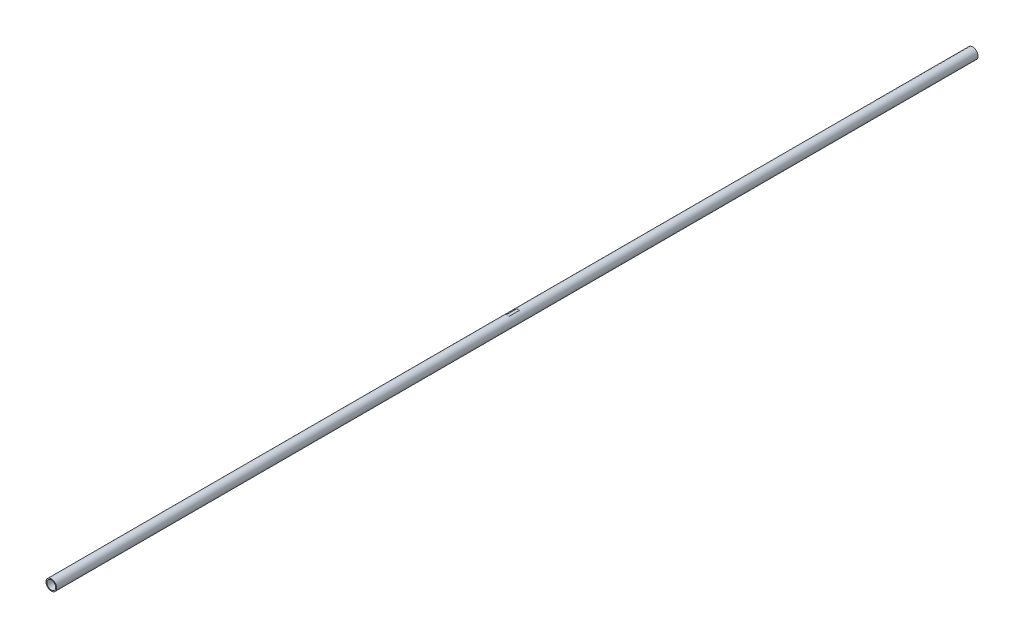
ISO-10303-21;
HEADER;
FILE_DESCRIPTION(('STEP AP214'),'2;1');
FILE_NAME('part.step','',(''),(''),'','','');
FILE_SCHEMA(('AUTOMOTIVE_DESIGN { 1 0 10303 214 1 1 1 1 }'));
ENDSEC;
DATA;
#1=APPLICATION_CONTEXT('core data for automotive mechanical design processes');
#2=APPLICATION_PROTOCOL_DEFINITION('international standard','automotive_design',2000,#1);
#3=PRODUCT_CONTEXT('',#1,'mechanical');
#4=PRODUCT('Part','Part','',(#3));
#5=PRODUCT_RELATED_PRODUCT_CATEGORY('part','',(#4));
#6=PRODUCT_DEFINITION_FORMATION('','',#4);
#7=PRODUCT_DEFINITION_CONTEXT('part definition',#1,'design');
#8=PRODUCT_DEFINITION('design','',#6,#7);
#9=PRODUCT_DEFINITION_SHAPE('','',#8);
#10=(LENGTH_UNIT() NAMED_UNIT(*) SI_UNIT(.MILLI.,.METRE.));
#11=(NAMED_UNIT(*) PLANE_ANGLE_UNIT() SI_UNIT($,.RADIAN.));
#12=(NAMED_UNIT(*) SI_UNIT($,.STERADIAN.) SOLID_ANGLE_UNIT());
#13=UNCERTAINTY_MEASURE_WITH_UNIT(LENGTH_MEASURE(1.E-05),#10,'distance_accuracy_value','');
#14=(GEOMETRIC_REPRESENTATION_CONTEXT(3) GLOBAL_UNCERTAINTY_ASSIGNED_CONTEXT((#13)) GLOBAL_UNIT_ASSIGNED_CONTEXT((#10,
#11,#12)) REPRESENTATION_CONTEXT('',''));
#15=CARTESIAN_POINT('',(0.,0.,0.));
#16=DIRECTION('',(0.,0.,1.));
#17=DIRECTION('',(1.,0.,0.));
#18=AXIS2_PLACEMENT_3D('',#15,#16,#17);
#19=CARTESIAN_POINT('',(0.,0.,3657.6));
#20=DIRECTION('',(0.,0.,1.));
#21=DIRECTION('',(1.,0.,0.));
#22=AXIS2_PLACEMENT_3D('',#19,#20,#21);
#23=PLANE('',#22);
#24=CARTESIAN_POINT('',(0.,0.,3657.6));
#25=DIRECTION('',(0.,0.,1.));
#26=DIRECTION('',(1.,0.,0.));
#27=AXIS2_PLACEMENT_3D('',#24,#25,#26);
#28=CIRCLE('',#27,21.082);
#29=CARTESIAN_POINT('',(21.082,0.,3657.6));
#30=VERTEX_POINT('',#29);
#31=EDGE_CURVE('E102',#30,#30,#28,.T.);
#32=ORIENTED_EDGE('',*,*,#31,.T.);
#33=EDGE_LOOP('',(#32));
#34=FACE_BOUND('',#33,.T.);
#35=CARTESIAN_POINT('',(0.,0.,3657.6));
#36=DIRECTION('',(0.,0.,1.));
#37=DIRECTION('',(1.,0.,0.));
#38=AXIS2_PLACEMENT_3D('',#35,#36,#37);
#39=CIRCLE('',#38,17.526);
#40=CARTESIAN_POINT('',(-17.526,0.,3657.6));
#41=VERTEX_POINT('',#40);
#42=EDGE_CURVE('E106',#41,#41,#39,.T.);
#43=ORIENTED_EDGE('',*,*,#42,.F.);
#44=EDGE_LOOP('',(#43));
#45=FACE_BOUND('',#44,.T.);
#46=ADVANCED_FACE('F51',(#34,#45),#23,.T.);
#47=CARTESIAN_POINT('',(0.,0.,0.));
#48=DIRECTION('',(0.,0.,1.));
#49=DIRECTION('',(1.,0.,0.));
#50=AXIS2_PLACEMENT_3D('',#47,#48,#49);
#51=PLANE('',#50);
#52=CARTESIAN_POINT('',(0.,0.,0.));
#53=DIRECTION('',(0.,0.,1.));
#54=DIRECTION('',(1.,0.,0.));
#55=AXIS2_PLACEMENT_3D('',#52,#53,#54);
#56=CIRCLE('',#55,21.082);
#57=CARTESIAN_POINT('',(21.082,0.,0.));
#58=VERTEX_POINT('',#57);
#59=EDGE_CURVE('E103',#58,#58,#56,.T.);
#60=ORIENTED_EDGE('',*,*,#59,.F.);
#61=EDGE_LOOP('',(#60));
#62=FACE_BOUND('',#61,.T.);
#63=CARTESIAN_POINT('',(0.,0.,0.));
#64=DIRECTION('',(0.,0.,1.));
#65=DIRECTION('',(1.,0.,0.));
#66=AXIS2_PLACEMENT_3D('',#63,#64,#65);
#67=CIRCLE('',#66,17.526);
#68=CARTESIAN_POINT('',(-17.526,0.,-4.44089209850063E-13));
#69=VERTEX_POINT('',#68);
#70=EDGE_CURVE('E92',#69,#69,#67,.T.);
#71=ORIENTED_EDGE('',*,*,#70,.T.);
#72=EDGE_LOOP('',(#71));
#73=FACE_BOUND('',#72,.T.);
#74=ADVANCED_FACE('F119',(#62,#73),#51,.F.);
#75=CARTESIAN_POINT('',(0.,0.,3657.6));
#76=DIRECTION('',(0.,0.,-1.));
#77=DIRECTION('',(-1.,0.,0.));
#78=AXIS2_PLACEMENT_3D('',#75,#76,#77);
#79=CYLINDRICAL_SURFACE('',#78,21.082);
#80=CARTESIAN_POINT('',(0.,0.,1846.16364197576));
#81=DIRECTION('',(0.,0.,1.));
#82=DIRECTION('',(1.,0.,0.));
#83=AXIS2_PLACEMENT_3D('',#80,#81,#82);
#84=CIRCLE('',#83,21.082);
#85=CARTESIAN_POINT('',(5.572983860416,20.3320578125172,1846.16364197576));
#86=VERTEX_POINT('',#85);
#87=CARTESIAN_POINT('',(-5.57298386041601,20.3320578125172,1846.16364197576));
#88=VERTEX_POINT('',#87);
#89=EDGE_CURVE('E60',#86,#88,#84,.T.);
#90=ORIENTED_EDGE('',*,*,#89,.T.);
#91=DIRECTION('',(0.,0.,-1.));
#92=VECTOR('',#91,1.);
#93=CARTESIAN_POINT('',(-5.572983860416,20.3320578125172,3657.6));
#94=LINE('',#93,#92);
#95=CARTESIAN_POINT('',(-5.57298386041601,20.3320578125172,1804.51583411197));
#96=VERTEX_POINT('',#95);
#97=EDGE_CURVE('E11',#88,#96,#94,.T.);
#98=ORIENTED_EDGE('',*,*,#97,.T.);
#99=CARTESIAN_POINT('',(0.,0.,1804.51583411197));
#100=DIRECTION('',(0.,0.,-1.));
#101=DIRECTION('',(-1.,0.,0.));
#102=AXIS2_PLACEMENT_3D('',#99,#100,#101);
#103=CIRCLE('',#102,21.082);
#104=CARTESIAN_POINT('',(5.572983860416,20.3320578125172,1804.51583411197));
#105=VERTEX_POINT('',#104);
#106=EDGE_CURVE('E82',#96,#105,#103,.T.);
#107=ORIENTED_EDGE('',*,*,#106,.T.);
#108=DIRECTION('',(0.,0.,-1.));
#109=VECTOR('',#108,1.);
#110=CARTESIAN_POINT('',(5.572983860416,20.3320578125172,3657.6));
#111=LINE('',#110,#109);
#112=EDGE_CURVE('E88',#105,#86,#111,.F.);
#113=ORIENTED_EDGE('',*,*,#112,.T.);
#114=EDGE_LOOP('',(#90,#98,#107,#113));
#115=FACE_BOUND('',#114,.T.);
#116=ORIENTED_EDGE('',*,*,#31,.F.);
#117=EDGE_LOOP('',(#116));
#118=FACE_BOUND('',#117,.T.);
#119=ORIENTED_EDGE('',*,*,#59,.T.);
#120=EDGE_LOOP('',(#119));
#121=FACE_BOUND('',#120,.T.);
#122=ADVANCED_FACE('F53',(#115,#118,#121),#79,.T.);
#123=CARTESIAN_POINT('',(0.,0.,3657.6));
#124=DIRECTION('',(0.,0.,-1.));
#125=DIRECTION('',(-1.,0.,0.));
#126=AXIS2_PLACEMENT_3D('',#123,#124,#125);
#127=CYLINDRICAL_SURFACE('',#126,17.526);
#128=CARTESIAN_POINT('',(-17.526,0.,3657.6));
#129=CARTESIAN_POINT('',(-17.526,0.,3619.5));
#130=CARTESIAN_POINT('',(-17.526,0.,3581.4));
#131=CARTESIAN_POINT('',(-17.526,0.,3505.2));
#132=CARTESIAN_POINT('',(-17.526,0.,3467.1));
#133=CARTESIAN_POINT('',(-17.526,0.,3390.9));
#134=CARTESIAN_POINT('',(-17.526,0.,3352.8));
#135=CARTESIAN_POINT('',(-17.526,0.,3276.6));
#136=CARTESIAN_POINT('',(-17.526,0.,3238.5));
#137=CARTESIAN_POINT('',(-17.526,0.,3162.3));
#138=CARTESIAN_POINT('',(-17.526,0.,3124.2));
#139=CARTESIAN_POINT('',(-17.526,0.,3048.));
#140=CARTESIAN_POINT('',(-17.526,0.,3009.9));
#141=CARTESIAN_POINT('',(-17.526,0.,2933.7));
#142=CARTESIAN_POINT('',(-17.526,0.,2895.6));
#143=CARTESIAN_POINT('',(-17.526,0.,2819.4));
#144=CARTESIAN_POINT('',(-17.526,0.,2781.3));
#145=CARTESIAN_POINT('',(-17.526,0.,2705.1));
#146=CARTESIAN_POINT('',(-17.526,0.,2667.));
#147=CARTESIAN_POINT('',(-17.526,0.,2590.8));
#148=CARTESIAN_POINT('',(-17.526,0.,2552.7));
#149=CARTESIAN_POINT('',(-17.526,0.,2476.5));
#150=CARTESIAN_POINT('',(-17.526,0.,2438.4));
#151=CARTESIAN_POINT('',(-17.526,0.,2362.2));
#152=CARTESIAN_POINT('',(-17.526,0.,2324.1));
#153=CARTESIAN_POINT('',(-17.526,0.,2247.9));
#154=CARTESIAN_POINT('',(-17.526,0.,2209.8));
#155=CARTESIAN_POINT('',(-17.526,0.,2133.6));
#156=CARTESIAN_POINT('',(-17.526,0.,2095.5));
#157=CARTESIAN_POINT('',(-17.526,0.,2019.3));
#158=CARTESIAN_POINT('',(-17.526,0.,1981.2));
#159=CARTESIAN_POINT('',(-17.526,0.,1905.));
#160=CARTESIAN_POINT('',(-17.526,0.,1866.9));
#161=CARTESIAN_POINT('',(-17.526,0.,1790.7));
#162=CARTESIAN_POINT('',(-17.526,0.,1752.6));
#163=CARTESIAN_POINT('',(-17.526,0.,1676.4));
#164=CARTESIAN_POINT('',(-17.526,0.,1638.3));
#165=CARTESIAN_POINT('',(-17.526,0.,1562.1));
#166=CARTESIAN_POINT('',(-17.526,0.,1524.));
#167=CARTESIAN_POINT('',(-17.526,0.,1447.8));
#168=CARTESIAN_POINT('',(-17.526,0.,1409.7));
#169=CARTESIAN_POINT('',(-17.526,0.,1333.5));
#170=CARTESIAN_POINT('',(-17.526,0.,1295.4));
#171=CARTESIAN_POINT('',(-17.526,0.,1219.2));
#172=CARTESIAN_POINT('',(-17.526,0.,1181.1));
#173=CARTESIAN_POINT('',(-17.526,0.,1104.9));
#174=CARTESIAN_POINT('',(-17.526,0.,1066.8));
#175=CARTESIAN_POINT('',(-17.526,0.,990.6));
#176=CARTESIAN_POINT('',(-17.526,0.,952.5));
#177=CARTESIAN_POINT('',(-17.526,0.,876.3));
#178=CARTESIAN_POINT('',(-17.526,0.,838.2));
#179=CARTESIAN_POINT('',(-17.526,0.,762.));
#180=CARTESIAN_POINT('',(-17.526,0.,723.9));
#181=CARTESIAN_POINT('',(-17.526,0.,647.7));
#182=CARTESIAN_POINT('',(-17.526,0.,609.6));
#183=CARTESIAN_POINT('',(-17.526,0.,533.4));
#184=CARTESIAN_POINT('',(-17.526,0.,495.3));
#185=CARTESIAN_POINT('',(-17.526,0.,419.1));
#186=CARTESIAN_POINT('',(-17.526,0.,381.));
#187=CARTESIAN_POINT('',(-17.526,0.,304.8));
#188=CARTESIAN_POINT('',(-17.526,0.,266.7));
#189=CARTESIAN_POINT('',(-17.526,0.,190.5));
#190=CARTESIAN_POINT('',(-17.526,0.,152.4));
#191=CARTESIAN_POINT('',(-17.526,0.,76.1999999999996));
#192=CARTESIAN_POINT('',(-17.526,0.,38.0999999999995));
#193=CARTESIAN_POINT('',(-17.526,0.,-4.44089209850063E-13));
#194=B_SPLINE_CURVE_WITH_KNOTS('',3,(#128,#129,#130,#131,#132,#133,#134,#135,#136,#137,#138,
#139,#140,#141,#142,#143,#144,#145,#146,#147,#148,#149,#150,#151,#152,#153,#154,#155,#156,#157,
#158,#159,#160,#161,#162,#163,#164,#165,#166,#167,#168,#169,#170,#171,#172,#173,#174,#175,#176,
#177,#178,#179,#180,#181,#182,#183,#184,#185,#186,#187,#188,#189,#190,#191,#192,#193),
.UNSPECIFIED.,.F.,.F.,(4,2,2,2,2,2,2,2,2,2,2,2,2,2,2,2,2,2,2,2,2,2,2,2,2,2,2,2,2,2,2,2,4),(0.,
114.3,228.6,342.9,457.2,571.5,685.8,800.1,914.4,1028.7,1143.,1257.3,1371.6,1485.9,1600.2,1714.5,
1828.8,1943.1,2057.4,2171.7,2286.,2400.3,2514.6,2628.9,2743.2,2857.5,2971.8,3086.1,3200.4,
3314.7,3429.,3543.3,3657.6),.UNSPECIFIED.);
#195=EDGE_CURVE('BSEAM115',#41,#69,#194,.T.);
#196=ORIENTED_EDGE('',*,*,#42,.T.);
#197=ORIENTED_EDGE('',*,*,#70,.F.);
#198=ORIENTED_EDGE('',*,*,#195,.T.);
#199=ORIENTED_EDGE('',*,*,#195,.F.);
#200=EDGE_LOOP('',(#196,#198,#197,#199));
#201=FACE_BOUND('',#200,.T.);
#202=ADVANCED_FACE('F115',(#201),#127,.F.);
#203=CARTESIAN_POINT('',(-21.082,26.1051361130955,1846.16364197576));
#204=DIRECTION('',(0.,0.,1.));
#205=DIRECTION('',(1.,0.,0.));
#206=AXIS2_PLACEMENT_3D('',#203,#204,#205);
#207=PLANE('',#206);
#208=DIRECTION('',(1.,0.,0.));
#209=VECTOR('',#208,1.);
#210=CARTESIAN_POINT('',(-21.082,20.3320578125172,1846.16364197576));
#211=LINE('',#210,#209);
#212=EDGE_CURVE('E70',#88,#86,#211,.T.);
#213=ORIENTED_EDGE('',*,*,#212,.F.);
#214=ORIENTED_EDGE('',*,*,#89,.F.);
#215=EDGE_LOOP('',(#213,#214));
#216=FACE_BOUND('',#215,.T.);
#217=ADVANCED_FACE('F129',(#216),#207,.F.);
#218=CARTESIAN_POINT('',(-21.082,26.1051361130955,1804.51583411197));
#219=DIRECTION('',(0.,0.,-1.));
#220=DIRECTION('',(-1.,0.,0.));
#221=AXIS2_PLACEMENT_3D('',#218,#219,#220);
#222=PLANE('',#221);
#223=DIRECTION('',(1.,0.,0.));
#224=VECTOR('',#223,1.);
#225=CARTESIAN_POINT('',(-21.082,20.3320578125172,1804.51583411197));
#226=LINE('',#225,#224);
#227=EDGE_CURVE('E84',#96,#105,#226,.T.);
#228=ORIENTED_EDGE('',*,*,#227,.T.);
#229=ORIENTED_EDGE('',*,*,#106,.F.);
#230=EDGE_LOOP('',(#228,#229));
#231=FACE_BOUND('',#230,.T.);
#232=ADVANCED_FACE('F83',(#231),#222,.F.);
#233=CARTESIAN_POINT('',(-21.082,20.3320578125172,1846.16364197576));
#234=DIRECTION('',(0.,-1.,0.));
#235=DIRECTION('',(0.,0.,-1.));
#236=AXIS2_PLACEMENT_3D('',#233,#234,#235);
#237=PLANE('',#236);
#238=ORIENTED_EDGE('',*,*,#212,.T.);
#239=ORIENTED_EDGE('',*,*,#112,.F.);
#240=ORIENTED_EDGE('',*,*,#227,.F.);
#241=ORIENTED_EDGE('',*,*,#97,.F.);
#242=EDGE_LOOP('',(#238,#239,#240,#241));
#243=FACE_BOUND('',#242,.T.);
#244=ADVANCED_FACE('F90',(#243),#237,.F.);
#245=CLOSED_SHELL('',(#46,#74,#122,#202,#217,#232,#244));
#246=MANIFOLD_SOLID_BREP('B2',#245);
#247=ADVANCED_BREP_SHAPE_REPRESENTATION('',(#18,#246),#14);
#248=SHAPE_DEFINITION_REPRESENTATION(#9,#247);
ENDSEC;
END-ISO-10303-21;
